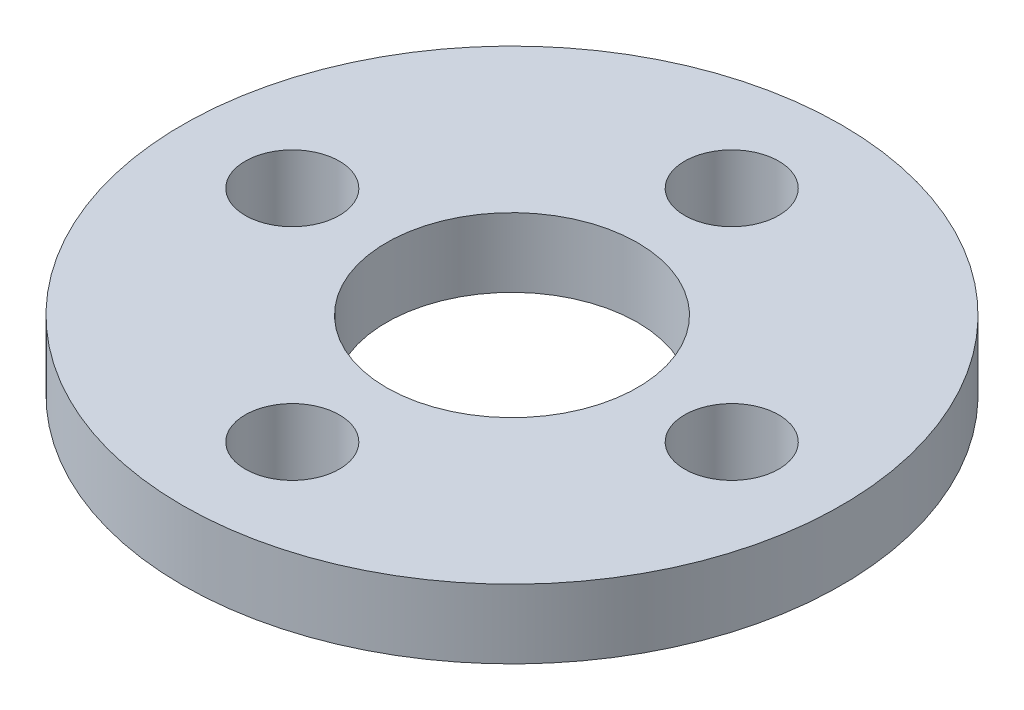
ISO-10303-21;
HEADER;
FILE_DESCRIPTION(('STEP AP214'),'2;1');
FILE_NAME('part.step','',(''),(''),'','','');
FILE_SCHEMA(('AUTOMOTIVE_DESIGN { 1 0 10303 214 1 1 1 1 }'));
ENDSEC;
DATA;
#1=APPLICATION_CONTEXT('core data for automotive mechanical design processes');
#2=APPLICATION_PROTOCOL_DEFINITION('international standard','automotive_design',2000,#1);
#3=PRODUCT_CONTEXT('',#1,'mechanical');
#4=PRODUCT('Part','Part','',(#3));
#5=PRODUCT_RELATED_PRODUCT_CATEGORY('part','',(#4));
#6=PRODUCT_DEFINITION_FORMATION('','',#4);
#7=PRODUCT_DEFINITION_CONTEXT('part definition',#1,'design');
#8=PRODUCT_DEFINITION('design','',#6,#7);
#9=PRODUCT_DEFINITION_SHAPE('','',#8);
#10=(LENGTH_UNIT() NAMED_UNIT(*) SI_UNIT(.MILLI.,.METRE.));
#11=(NAMED_UNIT(*) PLANE_ANGLE_UNIT() SI_UNIT($,.RADIAN.));
#12=(NAMED_UNIT(*) SI_UNIT($,.STERADIAN.) SOLID_ANGLE_UNIT());
#13=UNCERTAINTY_MEASURE_WITH_UNIT(LENGTH_MEASURE(1.E-05),#10,'distance_accuracy_value','');
#14=(GEOMETRIC_REPRESENTATION_CONTEXT(3) GLOBAL_UNCERTAINTY_ASSIGNED_CONTEXT((#13)) GLOBAL_UNIT_ASSIGNED_CONTEXT((#10,
#11,#12)) REPRESENTATION_CONTEXT('',''));
#15=CARTESIAN_POINT('',(0.,0.,0.));
#16=DIRECTION('',(0.,0.,1.));
#17=DIRECTION('',(1.,0.,0.));
#18=AXIS2_PLACEMENT_3D('',#15,#16,#17);
#19=CARTESIAN_POINT('',(0.,2.2,0.));
#20=DIRECTION('',(0.,-1.,0.));
#21=DIRECTION('',(0.,0.,-1.));
#22=AXIS2_PLACEMENT_3D('',#19,#20,#21);
#23=CYLINDRICAL_SURFACE('',#22,10.5);
#24=CARTESIAN_POINT('',(0.,2.2,0.));
#25=DIRECTION('',(0.,1.,0.));
#26=DIRECTION('',(0.,0.,1.));
#27=AXIS2_PLACEMENT_3D('',#24,#25,#26);
#28=CIRCLE('',#27,10.5);
#29=CARTESIAN_POINT('',(0.,2.2,10.5));
#30=VERTEX_POINT('',#29);
#31=EDGE_CURVE('E10',#30,#30,#28,.T.);
#32=ORIENTED_EDGE('',*,*,#31,.F.);
#33=EDGE_LOOP('',(#32));
#34=FACE_BOUND('',#33,.T.);
#35=CARTESIAN_POINT('',(0.,0.,0.));
#36=DIRECTION('',(0.,1.,0.));
#37=DIRECTION('',(0.,0.,1.));
#38=AXIS2_PLACEMENT_3D('',#35,#36,#37);
#39=CIRCLE('',#38,10.5);
#40=CARTESIAN_POINT('',(0.,0.,10.5));
#41=VERTEX_POINT('',#40);
#42=EDGE_CURVE('E34',#41,#41,#39,.T.);
#43=ORIENTED_EDGE('',*,*,#42,.T.);
#44=EDGE_LOOP('',(#43));
#45=FACE_BOUND('',#44,.T.);
#46=ADVANCED_FACE('F31',(#34,#45),#23,.T.);
#47=CARTESIAN_POINT('',(0.,2.2,0.));
#48=DIRECTION('',(0.,1.,0.));
#49=DIRECTION('',(0.,0.,1.));
#50=AXIS2_PLACEMENT_3D('',#47,#48,#49);
#51=PLANE('',#50);
#52=CARTESIAN_POINT('',(0.,2.2,-7.));
#53=DIRECTION('',(0.,1.,0.));
#54=DIRECTION('',(0.,0.,1.));
#55=AXIS2_PLACEMENT_3D('',#52,#53,#54);
#56=CIRCLE('',#55,1.5);
#57=CARTESIAN_POINT('',(0.,2.2,-5.5));
#58=VERTEX_POINT('',#57);
#59=EDGE_CURVE('E56',#58,#58,#56,.T.);
#60=ORIENTED_EDGE('',*,*,#59,.F.);
#61=EDGE_LOOP('',(#60));
#62=FACE_BOUND('',#61,.T.);
#63=CARTESIAN_POINT('',(7.0000000000002,2.2,-1.98094713253425E-13));
#64=DIRECTION('',(0.,1.,0.));
#65=DIRECTION('',(0.,0.,1.));
#66=AXIS2_PLACEMENT_3D('',#63,#64,#65);
#67=CIRCLE('',#66,1.50000000000015);
#68=CARTESIAN_POINT('',(7.0000000000002,2.2,1.49999999999996));
#69=VERTEX_POINT('',#68);
#70=EDGE_CURVE('E49',#69,#69,#67,.T.);
#71=ORIENTED_EDGE('',*,*,#70,.F.);
#72=EDGE_LOOP('',(#71));
#73=FACE_BOUND('',#72,.T.);
#74=CARTESIAN_POINT('',(3.9618942650685E-13,2.2,7.));
#75=DIRECTION('',(0.,1.,0.));
#76=DIRECTION('',(0.,0.,1.));
#77=AXIS2_PLACEMENT_3D('',#74,#75,#76);
#78=CIRCLE('',#77,1.50000000000043);
#79=CARTESIAN_POINT('',(3.9618942650685E-13,2.2,8.50000000000043));
#80=VERTEX_POINT('',#79);
#81=EDGE_CURVE('E67',#80,#80,#78,.T.);
#82=ORIENTED_EDGE('',*,*,#81,.F.);
#83=EDGE_LOOP('',(#82));
#84=FACE_BOUND('',#83,.T.);
#85=CARTESIAN_POINT('',(-6.9999999999998,2.2,1.98951966012828E-13));
#86=DIRECTION('',(0.,1.,0.));
#87=DIRECTION('',(0.,0.,1.));
#88=AXIS2_PLACEMENT_3D('',#85,#86,#87);
#89=CIRCLE('',#88,1.50000000000032);
#90=CARTESIAN_POINT('',(-6.9999999999998,2.2,1.50000000000052));
#91=VERTEX_POINT('',#90);
#92=EDGE_CURVE('E61',#91,#91,#89,.T.);
#93=ORIENTED_EDGE('',*,*,#92,.F.);
#94=EDGE_LOOP('',(#93));
#95=FACE_BOUND('',#94,.T.);
#96=CARTESIAN_POINT('',(0.,2.2,0.));
#97=DIRECTION('',(0.,1.,0.));
#98=DIRECTION('',(0.,0.,1.));
#99=AXIS2_PLACEMENT_3D('',#96,#97,#98);
#100=CIRCLE('',#99,4.);
#101=CARTESIAN_POINT('',(0.,2.2,4.));
#102=VERTEX_POINT('',#101);
#103=EDGE_CURVE('E43',#102,#102,#100,.T.);
#104=ORIENTED_EDGE('',*,*,#103,.F.);
#105=EDGE_LOOP('',(#104));
#106=FACE_BOUND('',#105,.T.);
#107=ORIENTED_EDGE('',*,*,#31,.T.);
#108=EDGE_LOOP('',(#107));
#109=FACE_BOUND('',#108,.T.);
#110=ADVANCED_FACE('F84',(#62,#73,#84,#95,#106,#109),#51,.T.);
#111=CARTESIAN_POINT('',(0.,0.,0.));
#112=DIRECTION('',(0.,1.,0.));
#113=DIRECTION('',(0.,0.,1.));
#114=AXIS2_PLACEMENT_3D('',#111,#112,#113);
#115=PLANE('',#114);
#116=CARTESIAN_POINT('',(0.,0.,-7.));
#117=DIRECTION('',(0.,1.,0.));
#118=DIRECTION('',(0.,0.,1.));
#119=AXIS2_PLACEMENT_3D('',#116,#117,#118);
#120=CIRCLE('',#119,1.5);
#121=CARTESIAN_POINT('',(0.,0.,-5.5));
#122=VERTEX_POINT('',#121);
#123=EDGE_CURVE('E46',#122,#122,#120,.T.);
#124=ORIENTED_EDGE('',*,*,#123,.T.);
#125=EDGE_LOOP('',(#124));
#126=FACE_BOUND('',#125,.T.);
#127=CARTESIAN_POINT('',(7.0000000000002,0.,-1.98094713253425E-13));
#128=DIRECTION('',(0.,1.,0.));
#129=DIRECTION('',(0.,0.,1.));
#130=AXIS2_PLACEMENT_3D('',#127,#128,#129);
#131=CIRCLE('',#130,1.50000000000015);
#132=CARTESIAN_POINT('',(7.0000000000002,0.,1.49999999999996));
#133=VERTEX_POINT('',#132);
#134=EDGE_CURVE('E52',#133,#133,#131,.T.);
#135=ORIENTED_EDGE('',*,*,#134,.T.);
#136=EDGE_LOOP('',(#135));
#137=FACE_BOUND('',#136,.T.);
#138=CARTESIAN_POINT('',(3.9618942650685E-13,0.,7.));
#139=DIRECTION('',(0.,1.,0.));
#140=DIRECTION('',(0.,0.,1.));
#141=AXIS2_PLACEMENT_3D('',#138,#139,#140);
#142=CIRCLE('',#141,1.50000000000043);
#143=CARTESIAN_POINT('',(3.9618942650685E-13,0.,8.50000000000043));
#144=VERTEX_POINT('',#143);
#145=EDGE_CURVE('E53',#144,#144,#142,.T.);
#146=ORIENTED_EDGE('',*,*,#145,.T.);
#147=EDGE_LOOP('',(#146));
#148=FACE_BOUND('',#147,.T.);
#149=CARTESIAN_POINT('',(-6.9999999999998,0.,1.98951966012828E-13));
#150=DIRECTION('',(0.,1.,0.));
#151=DIRECTION('',(0.,0.,1.));
#152=AXIS2_PLACEMENT_3D('',#149,#150,#151);
#153=CIRCLE('',#152,1.50000000000032);
#154=CARTESIAN_POINT('',(-6.9999999999998,0.,1.50000000000052));
#155=VERTEX_POINT('',#154);
#156=EDGE_CURVE('E64',#155,#155,#153,.T.);
#157=ORIENTED_EDGE('',*,*,#156,.T.);
#158=EDGE_LOOP('',(#157));
#159=FACE_BOUND('',#158,.T.);
#160=CARTESIAN_POINT('',(0.,0.,0.));
#161=DIRECTION('',(0.,1.,0.));
#162=DIRECTION('',(0.,0.,1.));
#163=AXIS2_PLACEMENT_3D('',#160,#161,#162);
#164=CIRCLE('',#163,4.);
#165=CARTESIAN_POINT('',(0.,0.,4.));
#166=VERTEX_POINT('',#165);
#167=EDGE_CURVE('E41',#166,#166,#164,.T.);
#168=ORIENTED_EDGE('',*,*,#167,.T.);
#169=EDGE_LOOP('',(#168));
#170=FACE_BOUND('',#169,.T.);
#171=ORIENTED_EDGE('',*,*,#42,.F.);
#172=EDGE_LOOP('',(#171));
#173=FACE_BOUND('',#172,.T.);
#174=ADVANCED_FACE('F73',(#126,#137,#148,#159,#170,#173),#115,.F.);
#175=CARTESIAN_POINT('',(0.,0.,0.));
#176=DIRECTION('',(0.,1.,0.));
#177=DIRECTION('',(0.,0.,1.));
#178=AXIS2_PLACEMENT_3D('',#175,#176,#177);
#179=CYLINDRICAL_SURFACE('',#178,4.);
#180=ORIENTED_EDGE('',*,*,#167,.F.);
#181=EDGE_LOOP('',(#180));
#182=FACE_BOUND('',#181,.T.);
#183=ORIENTED_EDGE('',*,*,#103,.T.);
#184=EDGE_LOOP('',(#183));
#185=FACE_BOUND('',#184,.T.);
#186=ADVANCED_FACE('F93',(#182,#185),#179,.F.);
#187=CARTESIAN_POINT('',(-6.9999999999998,0.,1.98951966012828E-13));
#188=DIRECTION('',(0.,1.,0.));
#189=DIRECTION('',(0.,0.,1.));
#190=AXIS2_PLACEMENT_3D('',#187,#188,#189);
#191=CYLINDRICAL_SURFACE('',#190,1.50000000000032);
#192=ORIENTED_EDGE('',*,*,#156,.F.);
#193=EDGE_LOOP('',(#192));
#194=FACE_BOUND('',#193,.T.);
#195=ORIENTED_EDGE('',*,*,#92,.T.);
#196=EDGE_LOOP('',(#195));
#197=FACE_BOUND('',#196,.T.);
#198=ADVANCED_FACE('F80',(#194,#197),#191,.F.);
#199=CARTESIAN_POINT('',(3.9618942650685E-13,0.,7.));
#200=DIRECTION('',(0.,1.,0.));
#201=DIRECTION('',(0.,0.,1.));
#202=AXIS2_PLACEMENT_3D('',#199,#200,#201);
#203=CYLINDRICAL_SURFACE('',#202,1.50000000000043);
#204=ORIENTED_EDGE('',*,*,#145,.F.);
#205=EDGE_LOOP('',(#204));
#206=FACE_BOUND('',#205,.T.);
#207=ORIENTED_EDGE('',*,*,#81,.T.);
#208=EDGE_LOOP('',(#207));
#209=FACE_BOUND('',#208,.T.);
#210=ADVANCED_FACE('F76',(#206,#209),#203,.F.);
#211=CARTESIAN_POINT('',(7.0000000000002,0.,-1.98094713253425E-13));
#212=DIRECTION('',(0.,1.,0.));
#213=DIRECTION('',(0.,0.,1.));
#214=AXIS2_PLACEMENT_3D('',#211,#212,#213);
#215=CYLINDRICAL_SURFACE('',#214,1.50000000000015);
#216=ORIENTED_EDGE('',*,*,#134,.F.);
#217=EDGE_LOOP('',(#216));
#218=FACE_BOUND('',#217,.T.);
#219=ORIENTED_EDGE('',*,*,#70,.T.);
#220=EDGE_LOOP('',(#219));
#221=FACE_BOUND('',#220,.T.);
#222=ADVANCED_FACE('F79',(#218,#221),#215,.F.);
#223=CARTESIAN_POINT('',(0.,0.,-7.));
#224=DIRECTION('',(0.,1.,0.));
#225=DIRECTION('',(0.,0.,1.));
#226=AXIS2_PLACEMENT_3D('',#223,#224,#225);
#227=CYLINDRICAL_SURFACE('',#226,1.5);
#228=ORIENTED_EDGE('',*,*,#123,.F.);
#229=EDGE_LOOP('',(#228));
#230=FACE_BOUND('',#229,.T.);
#231=ORIENTED_EDGE('',*,*,#59,.T.);
#232=EDGE_LOOP('',(#231));
#233=FACE_BOUND('',#232,.T.);
#234=ADVANCED_FACE('F146',(#230,#233),#227,.F.);
#235=CLOSED_SHELL('',(#46,#110,#174,#186,#198,#210,#222,#234));
#236=MANIFOLD_SOLID_BREP('B2',#235);
#237=ADVANCED_BREP_SHAPE_REPRESENTATION('',(#18,#236),#14);
#238=SHAPE_DEFINITION_REPRESENTATION(#9,#237);
ENDSEC;
END-ISO-10303-21;
